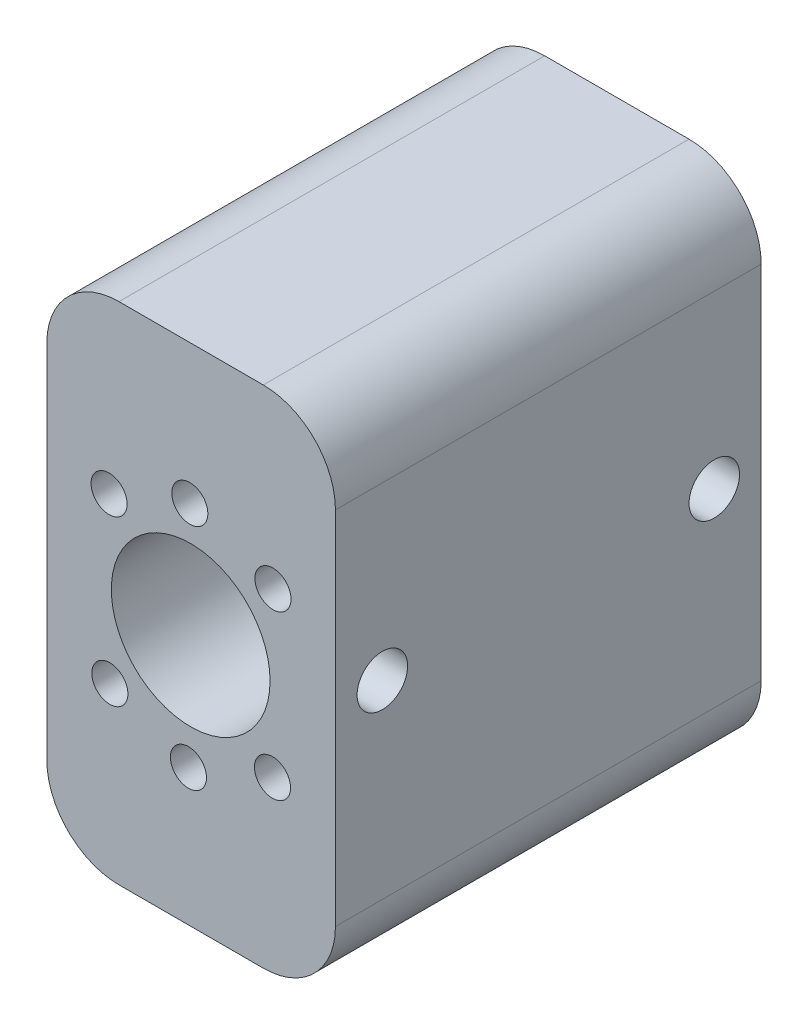
ISO-10303-21;
HEADER;
FILE_DESCRIPTION(('STEP AP214'),'2;1');
FILE_NAME('part.step','',(''),(''),'','','');
FILE_SCHEMA(('AUTOMOTIVE_DESIGN { 1 0 10303 214 1 1 1 1 }'));
ENDSEC;
DATA;
#1=APPLICATION_CONTEXT('core data for automotive mechanical design processes');
#2=APPLICATION_PROTOCOL_DEFINITION('international standard','automotive_design',2000,#1);
#3=PRODUCT_CONTEXT('',#1,'mechanical');
#4=PRODUCT('Part','Part','',(#3));
#5=PRODUCT_RELATED_PRODUCT_CATEGORY('part','',(#4));
#6=PRODUCT_DEFINITION_FORMATION('','',#4);
#7=PRODUCT_DEFINITION_CONTEXT('part definition',#1,'design');
#8=PRODUCT_DEFINITION('design','',#6,#7);
#9=PRODUCT_DEFINITION_SHAPE('','',#8);
#10=(LENGTH_UNIT() NAMED_UNIT(*) SI_UNIT(.MILLI.,.METRE.));
#11=(NAMED_UNIT(*) PLANE_ANGLE_UNIT() SI_UNIT($,.RADIAN.));
#12=(NAMED_UNIT(*) SI_UNIT($,.STERADIAN.) SOLID_ANGLE_UNIT());
#13=UNCERTAINTY_MEASURE_WITH_UNIT(LENGTH_MEASURE(1.E-05),#10,'distance_accuracy_value','');
#14=(GEOMETRIC_REPRESENTATION_CONTEXT(3) GLOBAL_UNCERTAINTY_ASSIGNED_CONTEXT((#13)) GLOBAL_UNIT_ASSIGNED_CONTEXT((#10,
#11,#12)) REPRESENTATION_CONTEXT('',''));
#15=CARTESIAN_POINT('',(0.,0.,0.));
#16=DIRECTION('',(0.,0.,1.));
#17=DIRECTION('',(1.,0.,0.));
#18=AXIS2_PLACEMENT_3D('',#15,#16,#17);
#19=CARTESIAN_POINT('',(-9.93916934376417,25.062794648046,59.));
#20=DIRECTION('',(0.,0.,-1.));
#21=DIRECTION('',(-1.,0.,0.));
#22=AXIS2_PLACEMENT_3D('',#19,#20,#21);
#23=CYLINDRICAL_SURFACE('',#22,10.);
#24=DIRECTION('',(0.,0.,1.));
#25=VECTOR('',#24,1.);
#26=CARTESIAN_POINT('',(-9.93916934376417,35.0627946480461,59.));
#27=LINE('',#26,#25);
#28=CARTESIAN_POINT('',(-9.93916934376417,35.0627946480461,0.));
#29=VERTEX_POINT('',#28);
#30=CARTESIAN_POINT('',(-9.93916934376417,35.0627946480461,59.));
#31=VERTEX_POINT('',#30);
#32=EDGE_CURVE('E158',#29,#31,#27,.T.);
#33=ORIENTED_EDGE('',*,*,#32,.F.);
#34=CARTESIAN_POINT('',(-9.93916934376417,25.062794648046,0.));
#35=DIRECTION('',(0.,0.,1.));
#36=DIRECTION('',(1.,0.,0.));
#37=AXIS2_PLACEMENT_3D('',#34,#35,#36);
#38=CIRCLE('',#37,10.);
#39=CARTESIAN_POINT('',(-19.9391693437642,25.0627946480461,0.));
#40=VERTEX_POINT('',#39);
#41=EDGE_CURVE('E47',#40,#29,#38,.F.);
#42=ORIENTED_EDGE('',*,*,#41,.F.);
#43=DIRECTION('',(0.,0.,1.));
#44=VECTOR('',#43,1.);
#45=CARTESIAN_POINT('',(-19.9391693437642,25.062794648046,59.));
#46=LINE('',#45,#44);
#47=CARTESIAN_POINT('',(-19.9391693437642,25.0627946480461,59.));
#48=VERTEX_POINT('',#47);
#49=EDGE_CURVE('E161',#48,#40,#46,.F.);
#50=ORIENTED_EDGE('',*,*,#49,.F.);
#51=CARTESIAN_POINT('',(-9.93916934376417,25.062794648046,59.));
#52=DIRECTION('',(0.,0.,1.));
#53=DIRECTION('',(1.,0.,0.));
#54=AXIS2_PLACEMENT_3D('',#51,#52,#53);
#55=CIRCLE('',#54,10.);
#56=EDGE_CURVE('E11',#31,#48,#55,.T.);
#57=ORIENTED_EDGE('',*,*,#56,.F.);
#58=EDGE_LOOP('',(#33,#42,#50,#57));
#59=FACE_BOUND('',#58,.T.);
#60=ADVANCED_FACE('F40',(#59),#23,.T.);
#61=CARTESIAN_POINT('',(-9.93916934376417,-24.937205351954,59.));
#62=DIRECTION('',(0.,0.,1.));
#63=DIRECTION('',(1.,0.,0.));
#64=AXIS2_PLACEMENT_3D('',#61,#62,#63);
#65=CYLINDRICAL_SURFACE('',#64,10.);
#66=DIRECTION('',(0.,0.,1.));
#67=VECTOR('',#66,1.);
#68=CARTESIAN_POINT('',(-19.9391693437642,-24.937205351954,59.));
#69=LINE('',#68,#67);
#70=CARTESIAN_POINT('',(-19.9391693437642,-24.937205351954,0.));
#71=VERTEX_POINT('',#70);
#72=CARTESIAN_POINT('',(-19.9391693437642,-24.937205351954,59.));
#73=VERTEX_POINT('',#72);
#74=EDGE_CURVE('E147',#71,#73,#69,.T.);
#75=ORIENTED_EDGE('',*,*,#74,.F.);
#76=CARTESIAN_POINT('',(-9.93916934376417,-24.937205351954,0.));
#77=DIRECTION('',(0.,0.,1.));
#78=DIRECTION('',(1.,0.,0.));
#79=AXIS2_PLACEMENT_3D('',#76,#77,#78);
#80=CIRCLE('',#79,10.);
#81=CARTESIAN_POINT('',(-9.93916934376417,-34.937205351954,0.));
#82=VERTEX_POINT('',#81);
#83=EDGE_CURVE('E153',#82,#71,#80,.F.);
#84=ORIENTED_EDGE('',*,*,#83,.F.);
#85=DIRECTION('',(0.,0.,1.));
#86=VECTOR('',#85,1.);
#87=CARTESIAN_POINT('',(-9.93916934376417,-34.937205351954,59.));
#88=LINE('',#87,#86);
#89=CARTESIAN_POINT('',(-9.93916934376417,-34.937205351954,59.));
#90=VERTEX_POINT('',#89);
#91=EDGE_CURVE('E150',#90,#82,#88,.F.);
#92=ORIENTED_EDGE('',*,*,#91,.F.);
#93=CARTESIAN_POINT('',(-9.93916934376417,-24.937205351954,59.));
#94=DIRECTION('',(0.,0.,1.));
#95=DIRECTION('',(1.,0.,0.));
#96=AXIS2_PLACEMENT_3D('',#93,#94,#95);
#97=CIRCLE('',#96,10.);
#98=EDGE_CURVE('E156',#73,#90,#97,.T.);
#99=ORIENTED_EDGE('',*,*,#98,.F.);
#100=EDGE_LOOP('',(#75,#84,#92,#99));
#101=FACE_BOUND('',#100,.T.);
#102=ADVANCED_FACE('F190',(#101),#65,.T.);
#103=CARTESIAN_POINT('',(10.0608306562358,-24.937205351954,59.));
#104=DIRECTION('',(0.,0.,1.));
#105=DIRECTION('',(1.,0.,0.));
#106=AXIS2_PLACEMENT_3D('',#103,#104,#105);
#107=CYLINDRICAL_SURFACE('',#106,10.);
#108=DIRECTION('',(0.,0.,-1.));
#109=VECTOR('',#108,1.);
#110=CARTESIAN_POINT('',(20.0608306562358,-24.937205351954,59.));
#111=LINE('',#110,#109);
#112=CARTESIAN_POINT('',(20.0608306562358,-24.937205351954,59.));
#113=VERTEX_POINT('',#112);
#114=CARTESIAN_POINT('',(20.0608306562358,-24.937205351954,0.));
#115=VERTEX_POINT('',#114);
#116=EDGE_CURVE('E128',#113,#115,#111,.T.);
#117=ORIENTED_EDGE('',*,*,#116,.F.);
#118=CARTESIAN_POINT('',(10.0608306562358,-24.937205351954,59.));
#119=DIRECTION('',(0.,0.,1.));
#120=DIRECTION('',(1.,0.,0.));
#121=AXIS2_PLACEMENT_3D('',#118,#119,#120);
#122=CIRCLE('',#121,10.);
#123=CARTESIAN_POINT('',(10.0608306562358,-34.937205351954,59.));
#124=VERTEX_POINT('',#123);
#125=EDGE_CURVE('E143',#124,#113,#122,.T.);
#126=ORIENTED_EDGE('',*,*,#125,.F.);
#127=DIRECTION('',(0.,0.,-1.));
#128=VECTOR('',#127,1.);
#129=CARTESIAN_POINT('',(10.0608306562358,-34.937205351954,59.));
#130=LINE('',#129,#128);
#131=CARTESIAN_POINT('',(10.0608306562358,-34.937205351954,0.));
#132=VERTEX_POINT('',#131);
#133=EDGE_CURVE('E140',#132,#124,#130,.F.);
#134=ORIENTED_EDGE('',*,*,#133,.F.);
#135=CARTESIAN_POINT('',(10.0608306562358,-24.937205351954,0.));
#136=DIRECTION('',(0.,0.,1.));
#137=DIRECTION('',(1.,0.,0.));
#138=AXIS2_PLACEMENT_3D('',#135,#136,#137);
#139=CIRCLE('',#138,10.);
#140=EDGE_CURVE('E145',#115,#132,#139,.F.);
#141=ORIENTED_EDGE('',*,*,#140,.F.);
#142=EDGE_LOOP('',(#117,#126,#134,#141));
#143=FACE_BOUND('',#142,.T.);
#144=ADVANCED_FACE('F203',(#143),#107,.T.);
#145=CARTESIAN_POINT('',(10.0608306562358,25.062794648046,59.));
#146=DIRECTION('',(0.,0.,1.));
#147=DIRECTION('',(1.,0.,0.));
#148=AXIS2_PLACEMENT_3D('',#145,#146,#147);
#149=CYLINDRICAL_SURFACE('',#148,10.);
#150=DIRECTION('',(0.,0.,1.));
#151=VECTOR('',#150,1.);
#152=CARTESIAN_POINT('',(20.0608306562358,25.062794648046,59.));
#153=LINE('',#152,#151);
#154=CARTESIAN_POINT('',(20.0608306562358,25.0627946480461,0.));
#155=VERTEX_POINT('',#154);
#156=CARTESIAN_POINT('',(20.0608306562358,25.0627946480461,59.));
#157=VERTEX_POINT('',#156);
#158=EDGE_CURVE('E117',#155,#157,#153,.T.);
#159=ORIENTED_EDGE('',*,*,#158,.F.);
#160=CARTESIAN_POINT('',(10.0608306562358,25.062794648046,0.));
#161=DIRECTION('',(0.,0.,1.));
#162=DIRECTION('',(1.,0.,0.));
#163=AXIS2_PLACEMENT_3D('',#160,#161,#162);
#164=CIRCLE('',#163,10.);
#165=CARTESIAN_POINT('',(10.0608306562358,35.0627946480461,0.));
#166=VERTEX_POINT('',#165);
#167=EDGE_CURVE('E101',#166,#155,#164,.F.);
#168=ORIENTED_EDGE('',*,*,#167,.F.);
#169=DIRECTION('',(0.,0.,1.));
#170=VECTOR('',#169,1.);
#171=CARTESIAN_POINT('',(10.0608306562358,35.0627946480461,59.));
#172=LINE('',#171,#170);
#173=CARTESIAN_POINT('',(10.0608306562358,35.0627946480461,59.));
#174=VERTEX_POINT('',#173);
#175=EDGE_CURVE('E114',#174,#166,#172,.F.);
#176=ORIENTED_EDGE('',*,*,#175,.F.);
#177=CARTESIAN_POINT('',(10.0608306562358,25.062794648046,59.));
#178=DIRECTION('',(0.,0.,1.));
#179=DIRECTION('',(1.,0.,0.));
#180=AXIS2_PLACEMENT_3D('',#177,#178,#179);
#181=CIRCLE('',#180,10.);
#182=EDGE_CURVE('E113',#157,#174,#181,.T.);
#183=ORIENTED_EDGE('',*,*,#182,.F.);
#184=EDGE_LOOP('',(#159,#168,#176,#183));
#185=FACE_BOUND('',#184,.T.);
#186=ADVANCED_FACE('F118',(#185),#149,.T.);
#187=CARTESIAN_POINT('',(-19.9391693437642,35.0627946480461,59.));
#188=DIRECTION('',(1.,0.,0.));
#189=DIRECTION('',(0.,0.,-1.));
#190=AXIS2_PLACEMENT_3D('',#187,#188,#189);
#191=PLANE('',#190);
#192=CARTESIAN_POINT('',(-19.9391693437642,0.0627946480460627,39.5));
#193=DIRECTION('',(-1.,0.,0.));
#194=DIRECTION('',(0.,0.,1.));
#195=AXIS2_PLACEMENT_3D('',#192,#193,#194);
#196=CIRCLE('',#195,2.55);
#197=CARTESIAN_POINT('',(-19.9391693437642,0.0627946480460627,42.05));
#198=VERTEX_POINT('',#197);
#199=EDGE_CURVE('E581',#198,#198,#196,.T.);
#200=ORIENTED_EDGE('',*,*,#199,.F.);
#201=EDGE_LOOP('',(#200));
#202=FACE_BOUND('',#201,.T.);
#203=CARTESIAN_POINT('',(-19.9391693437642,0.0627946480460601,19.5));
#204=DIRECTION('',(-1.,0.,0.));
#205=DIRECTION('',(0.,0.,1.));
#206=AXIS2_PLACEMENT_3D('',#203,#204,#205);
#207=CIRCLE('',#206,2.55);
#208=CARTESIAN_POINT('',(-19.9391693437642,0.0627946480460601,22.05));
#209=VERTEX_POINT('',#208);
#210=EDGE_CURVE('E588',#209,#209,#207,.T.);
#211=ORIENTED_EDGE('',*,*,#210,.F.);
#212=EDGE_LOOP('',(#211));
#213=FACE_BOUND('',#212,.T.);
#214=CARTESIAN_POINT('',(-19.9391693437642,10.0627946480461,29.5));
#215=DIRECTION('',(-1.,0.,0.));
#216=DIRECTION('',(0.,0.,1.));
#217=AXIS2_PLACEMENT_3D('',#214,#215,#216);
#218=CIRCLE('',#217,2.55);
#219=CARTESIAN_POINT('',(-19.9391693437642,10.0627946480461,32.05));
#220=VERTEX_POINT('',#219);
#221=EDGE_CURVE('E572',#220,#220,#218,.T.);
#222=ORIENTED_EDGE('',*,*,#221,.F.);
#223=EDGE_LOOP('',(#222));
#224=FACE_BOUND('',#223,.T.);
#225=CARTESIAN_POINT('',(-19.9391693437642,-9.93720535195394,29.5));
#226=DIRECTION('',(-1.,0.,0.));
#227=DIRECTION('',(0.,0.,1.));
#228=AXIS2_PLACEMENT_3D('',#225,#226,#227);
#229=CIRCLE('',#228,2.55);
#230=CARTESIAN_POINT('',(-19.9391693437642,-9.93720535195394,32.05));
#231=VERTEX_POINT('',#230);
#232=EDGE_CURVE('E561',#231,#231,#229,.T.);
#233=ORIENTED_EDGE('',*,*,#232,.F.);
#234=EDGE_LOOP('',(#233));
#235=FACE_BOUND('',#234,.T.);
#236=CARTESIAN_POINT('',(-19.9391693437642,0.0627946480460592,29.5));
#237=DIRECTION('',(-1.,0.,0.));
#238=DIRECTION('',(0.,0.,1.));
#239=AXIS2_PLACEMENT_3D('',#236,#237,#238);
#240=CIRCLE('',#239,2.55);
#241=CARTESIAN_POINT('',(-19.9391693437642,0.0627946480460592,32.05));
#242=VERTEX_POINT('',#241);
#243=EDGE_CURVE('E584',#242,#242,#240,.T.);
#244=ORIENTED_EDGE('',*,*,#243,.F.);
#245=EDGE_LOOP('',(#244));
#246=FACE_BOUND('',#245,.T.);
#247=DIRECTION('',(0.,-1.,0.));
#248=VECTOR('',#247,1.);
#249=CARTESIAN_POINT('',(-19.9391693437642,35.0627946480461,59.));
#250=LINE('',#249,#248);
#251=EDGE_CURVE('E131',#48,#73,#250,.T.);
#252=ORIENTED_EDGE('',*,*,#251,.F.);
#253=ORIENTED_EDGE('',*,*,#49,.T.);
#254=DIRECTION('',(0.,-1.,0.));
#255=VECTOR('',#254,1.);
#256=CARTESIAN_POINT('',(-19.9391693437642,35.0627946480461,0.));
#257=LINE('',#256,#255);
#258=EDGE_CURVE('E133',#40,#71,#257,.T.);
#259=ORIENTED_EDGE('',*,*,#258,.T.);
#260=ORIENTED_EDGE('',*,*,#74,.T.);
#261=EDGE_LOOP('',(#252,#253,#259,#260));
#262=FACE_BOUND('',#261,.T.);
#263=ADVANCED_FACE('F192',(#202,#213,#224,#235,#246,#262),#191,.F.);
#264=CARTESIAN_POINT('',(-19.9391693437642,-34.937205351954,59.));
#265=DIRECTION('',(0.,1.,0.));
#266=DIRECTION('',(0.,0.,1.));
#267=AXIS2_PLACEMENT_3D('',#264,#265,#266);
#268=PLANE('',#267);
#269=DIRECTION('',(1.,0.,0.));
#270=VECTOR('',#269,1.);
#271=CARTESIAN_POINT('',(-19.9391693437642,-34.937205351954,59.));
#272=LINE('',#271,#270);
#273=EDGE_CURVE('E168',#90,#124,#272,.T.);
#274=ORIENTED_EDGE('',*,*,#273,.F.);
#275=ORIENTED_EDGE('',*,*,#91,.T.);
#276=DIRECTION('',(1.,0.,0.));
#277=VECTOR('',#276,1.);
#278=CARTESIAN_POINT('',(-19.9391693437642,-34.937205351954,0.));
#279=LINE('',#278,#277);
#280=EDGE_CURVE('E129',#82,#132,#279,.T.);
#281=ORIENTED_EDGE('',*,*,#280,.T.);
#282=ORIENTED_EDGE('',*,*,#133,.T.);
#283=EDGE_LOOP('',(#274,#275,#281,#282));
#284=FACE_BOUND('',#283,.T.);
#285=ADVANCED_FACE('F194',(#284),#268,.F.);
#286=CARTESIAN_POINT('',(20.0608306562358,35.0627946480461,59.));
#287=DIRECTION('',(1.,0.,0.));
#288=DIRECTION('',(0.,0.,-1.));
#289=AXIS2_PLACEMENT_3D('',#286,#287,#288);
#290=PLANE('',#289);
#291=CARTESIAN_POINT('',(20.0608306562358,1.34000523,52.5));
#292=DIRECTION('',(1.,0.,0.));
#293=DIRECTION('',(0.,0.,-1.));
#294=AXIS2_PLACEMENT_3D('',#291,#292,#293);
#295=CIRCLE('',#294,3.5);
#296=CARTESIAN_POINT('',(20.0608306562358,1.34000523,49.));
#297=VERTEX_POINT('',#296);
#298=EDGE_CURVE('E558',#297,#297,#295,.T.);
#299=ORIENTED_EDGE('',*,*,#298,.F.);
#300=EDGE_LOOP('',(#299));
#301=FACE_BOUND('',#300,.T.);
#302=CARTESIAN_POINT('',(20.0608306562358,1.34000523,6.5));
#303=DIRECTION('',(1.,0.,0.));
#304=DIRECTION('',(0.,0.,-1.));
#305=AXIS2_PLACEMENT_3D('',#302,#303,#304);
#306=CIRCLE('',#305,3.5);
#307=CARTESIAN_POINT('',(20.0608306562358,1.34000523,3.));
#308=VERTEX_POINT('',#307);
#309=EDGE_CURVE('E564',#308,#308,#306,.T.);
#310=ORIENTED_EDGE('',*,*,#309,.F.);
#311=EDGE_LOOP('',(#310));
#312=FACE_BOUND('',#311,.T.);
#313=DIRECTION('',(0.,-1.,0.));
#314=VECTOR('',#313,1.);
#315=CARTESIAN_POINT('',(20.0608306562358,35.0627946480461,59.));
#316=LINE('',#315,#314);
#317=EDGE_CURVE('E164',#157,#113,#316,.T.);
#318=ORIENTED_EDGE('',*,*,#317,.T.);
#319=ORIENTED_EDGE('',*,*,#116,.T.);
#320=DIRECTION('',(0.,-1.,0.));
#321=VECTOR('',#320,1.);
#322=CARTESIAN_POINT('',(20.0608306562358,35.0627946480461,0.));
#323=LINE('',#322,#321);
#324=EDGE_CURVE('E107',#155,#115,#323,.T.);
#325=ORIENTED_EDGE('',*,*,#324,.F.);
#326=ORIENTED_EDGE('',*,*,#158,.T.);
#327=EDGE_LOOP('',(#318,#319,#325,#326));
#328=FACE_BOUND('',#327,.T.);
#329=ADVANCED_FACE('F126',(#301,#312,#328),#290,.T.);
#330=CARTESIAN_POINT('',(-19.9391693437642,35.0627946480461,59.));
#331=DIRECTION('',(0.,1.,0.));
#332=DIRECTION('',(0.,0.,1.));
#333=AXIS2_PLACEMENT_3D('',#330,#331,#332);
#334=PLANE('',#333);
#335=DIRECTION('',(1.,0.,0.));
#336=VECTOR('',#335,1.);
#337=CARTESIAN_POINT('',(-19.9391693437642,35.0627946480461,0.));
#338=LINE('',#337,#336);
#339=EDGE_CURVE('E109',#29,#166,#338,.T.);
#340=ORIENTED_EDGE('',*,*,#339,.F.);
#341=ORIENTED_EDGE('',*,*,#32,.T.);
#342=DIRECTION('',(1.,0.,0.));
#343=VECTOR('',#342,1.);
#344=CARTESIAN_POINT('',(-19.9391693437642,35.0627946480461,59.));
#345=LINE('',#344,#343);
#346=EDGE_CURVE('E123',#31,#174,#345,.T.);
#347=ORIENTED_EDGE('',*,*,#346,.T.);
#348=ORIENTED_EDGE('',*,*,#175,.T.);
#349=EDGE_LOOP('',(#340,#341,#347,#348));
#350=FACE_BOUND('',#349,.T.);
#351=ADVANCED_FACE('F163',(#350),#334,.T.);
#352=CARTESIAN_POINT('',(0.,0.,59.));
#353=DIRECTION('',(0.,0.,1.));
#354=DIRECTION('',(1.,0.,0.));
#355=AXIS2_PLACEMENT_3D('',#352,#353,#354);
#356=PLANE('',#355);
#357=CARTESIAN_POINT('',(-11.3137084989847,11.3137084989848,59.));
#358=DIRECTION('',(0.,0.,1.));
#359=DIRECTION('',(1.,0.,0.));
#360=AXIS2_PLACEMENT_3D('',#357,#358,#359);
#361=CIRCLE('',#360,2.5);
#362=CARTESIAN_POINT('',(-8.8137084989847,11.3137084989848,59.));
#363=VERTEX_POINT('',#362);
#364=EDGE_CURVE('E612',#363,#363,#361,.T.);
#365=ORIENTED_EDGE('',*,*,#364,.F.);
#366=EDGE_LOOP('',(#365));
#367=FACE_BOUND('',#366,.T.);
#368=CARTESIAN_POINT('',(-0.122338903727766,15.7597255865445,59.));
#369=DIRECTION('',(0.,0.,1.));
#370=DIRECTION('',(1.,0.,0.));
#371=AXIS2_PLACEMENT_3D('',#368,#369,#370);
#372=CIRCLE('',#371,2.5);
#373=CARTESIAN_POINT('',(2.37766109627223,15.7597255865445,59.));
#374=VERTEX_POINT('',#373);
#375=EDGE_CURVE('E618',#374,#374,#372,.T.);
#376=ORIENTED_EDGE('',*,*,#375,.F.);
#377=EDGE_LOOP('',(#376));
#378=FACE_BOUND('',#377,.T.);
#379=CARTESIAN_POINT('',(11.4026934424135,11.2636964844784,59.));
#380=DIRECTION('',(0.,0.,1.));
#381=DIRECTION('',(1.,0.,0.));
#382=AXIS2_PLACEMENT_3D('',#379,#380,#381);
#383=CIRCLE('',#382,2.5);
#384=CARTESIAN_POINT('',(13.9026934424135,11.2636964844784,59.));
#385=VERTEX_POINT('',#384);
#386=EDGE_CURVE('E624',#385,#385,#383,.T.);
#387=ORIENTED_EDGE('',*,*,#386,.F.);
#388=EDGE_LOOP('',(#387));
#389=FACE_BOUND('',#388,.T.);
#390=CARTESIAN_POINT('',(11.3393690888633,-11.4064220865028,59.));
#391=DIRECTION('',(0.,0.,1.));
#392=DIRECTION('',(1.,0.,0.));
#393=AXIS2_PLACEMENT_3D('',#390,#391,#392);
#394=CIRCLE('',#393,2.5);
#395=CARTESIAN_POINT('',(13.8393690888633,-11.4064220865028,59.));
#396=VERTEX_POINT('',#395);
#397=EDGE_CURVE('E183',#396,#396,#394,.T.);
#398=ORIENTED_EDGE('',*,*,#397,.F.);
#399=EDGE_LOOP('',(#398));
#400=FACE_BOUND('',#399,.T.);
#401=CARTESIAN_POINT('',(-0.312311964378448,-16.0290998956694,59.));
#402=DIRECTION('',(0.,0.,1.));
#403=DIRECTION('',(1.,0.,0.));
#404=AXIS2_PLACEMENT_3D('',#401,#402,#403);
#405=CIRCLE('',#404,2.5);
#406=CARTESIAN_POINT('',(2.18768803562155,-16.0290998956694,59.));
#407=VERTEX_POINT('',#406);
#408=EDGE_CURVE('E602',#407,#407,#405,.T.);
#409=ORIENTED_EDGE('',*,*,#408,.F.);
#410=EDGE_LOOP('',(#409));
#411=FACE_BOUND('',#410,.T.);
#412=CARTESIAN_POINT('',(-11.2041007750175,-11.4064220865028,59.));
#413=DIRECTION('',(0.,0.,1.));
#414=DIRECTION('',(1.,0.,0.));
#415=AXIS2_PLACEMENT_3D('',#412,#413,#414);
#416=CIRCLE('',#415,2.5);
#417=CARTESIAN_POINT('',(-8.70410077501747,-11.4064220865028,59.));
#418=VERTEX_POINT('',#417);
#419=EDGE_CURVE('E596',#418,#418,#416,.T.);
#420=ORIENTED_EDGE('',*,*,#419,.F.);
#421=EDGE_LOOP('',(#420));
#422=FACE_BOUND('',#421,.T.);
#423=CARTESIAN_POINT('',(0.,0.,59.));
#424=DIRECTION('',(0.,0.,1.));
#425=DIRECTION('',(1.,0.,0.));
#426=AXIS2_PLACEMENT_3D('',#423,#424,#425);
#427=CIRCLE('',#426,11.);
#428=CARTESIAN_POINT('',(11.,0.,59.));
#429=VERTEX_POINT('',#428);
#430=EDGE_CURVE('E172',#429,#429,#427,.T.);
#431=ORIENTED_EDGE('',*,*,#430,.F.);
#432=EDGE_LOOP('',(#431));
#433=FACE_BOUND('',#432,.T.);
#434=ORIENTED_EDGE('',*,*,#346,.F.);
#435=ORIENTED_EDGE('',*,*,#56,.T.);
#436=ORIENTED_EDGE('',*,*,#251,.T.);
#437=ORIENTED_EDGE('',*,*,#98,.T.);
#438=ORIENTED_EDGE('',*,*,#273,.T.);
#439=ORIENTED_EDGE('',*,*,#125,.T.);
#440=ORIENTED_EDGE('',*,*,#317,.F.);
#441=ORIENTED_EDGE('',*,*,#182,.T.);
#442=EDGE_LOOP('',(#434,#435,#436,#437,#438,#439,#440,#441));
#443=FACE_BOUND('',#442,.T.);
#444=ADVANCED_FACE('F166',(#367,#378,#389,#400,#411,#422,#433,#443),#356,.T.);
#445=CARTESIAN_POINT('',(0.,0.,0.));
#446=DIRECTION('',(0.,0.,1.));
#447=DIRECTION('',(1.,0.,0.));
#448=AXIS2_PLACEMENT_3D('',#445,#446,#447);
#449=PLANE('',#448);
#450=CARTESIAN_POINT('',(-11.3137084989847,11.3137084989848,0.));
#451=DIRECTION('',(0.,0.,1.));
#452=DIRECTION('',(1.,0.,0.));
#453=AXIS2_PLACEMENT_3D('',#450,#451,#452);
#454=CIRCLE('',#453,2.5);
#455=CARTESIAN_POINT('',(-8.8137084989847,11.3137084989848,0.));
#456=VERTEX_POINT('',#455);
#457=EDGE_CURVE('E180',#456,#456,#454,.T.);
#458=ORIENTED_EDGE('',*,*,#457,.T.);
#459=EDGE_LOOP('',(#458));
#460=FACE_BOUND('',#459,.T.);
#461=CARTESIAN_POINT('',(-0.122338903727766,15.7597255865445,0.));
#462=DIRECTION('',(0.,0.,1.));
#463=DIRECTION('',(1.,0.,0.));
#464=AXIS2_PLACEMENT_3D('',#461,#462,#463);
#465=CIRCLE('',#464,2.5);
#466=CARTESIAN_POINT('',(2.37766109627223,15.7597255865445,0.));
#467=VERTEX_POINT('',#466);
#468=EDGE_CURVE('E615',#467,#467,#465,.T.);
#469=ORIENTED_EDGE('',*,*,#468,.T.);
#470=EDGE_LOOP('',(#469));
#471=FACE_BOUND('',#470,.T.);
#472=CARTESIAN_POINT('',(11.4026934424135,11.2636964844784,0.));
#473=DIRECTION('',(0.,0.,1.));
#474=DIRECTION('',(1.,0.,0.));
#475=AXIS2_PLACEMENT_3D('',#472,#473,#474);
#476=CIRCLE('',#475,2.5);
#477=CARTESIAN_POINT('',(13.9026934424135,11.2636964844784,0.));
#478=VERTEX_POINT('',#477);
#479=EDGE_CURVE('E621',#478,#478,#476,.T.);
#480=ORIENTED_EDGE('',*,*,#479,.T.);
#481=EDGE_LOOP('',(#480));
#482=FACE_BOUND('',#481,.T.);
#483=CARTESIAN_POINT('',(11.3393690888633,-11.4064220865028,0.));
#484=DIRECTION('',(0.,0.,1.));
#485=DIRECTION('',(1.,0.,0.));
#486=AXIS2_PLACEMENT_3D('',#483,#484,#485);
#487=CIRCLE('',#486,2.5);
#488=CARTESIAN_POINT('',(13.8393690888633,-11.4064220865028,0.));
#489=VERTEX_POINT('',#488);
#490=EDGE_CURVE('E626',#489,#489,#487,.T.);
#491=ORIENTED_EDGE('',*,*,#490,.T.);
#492=EDGE_LOOP('',(#491));
#493=FACE_BOUND('',#492,.T.);
#494=CARTESIAN_POINT('',(-0.312311964378448,-16.0290998956694,0.));
#495=DIRECTION('',(0.,0.,1.));
#496=DIRECTION('',(1.,0.,0.));
#497=AXIS2_PLACEMENT_3D('',#494,#495,#496);
#498=CIRCLE('',#497,2.5);
#499=CARTESIAN_POINT('',(2.18768803562155,-16.0290998956694,0.));
#500=VERTEX_POINT('',#499);
#501=EDGE_CURVE('E599',#500,#500,#498,.T.);
#502=ORIENTED_EDGE('',*,*,#501,.T.);
#503=EDGE_LOOP('',(#502));
#504=FACE_BOUND('',#503,.T.);
#505=CARTESIAN_POINT('',(-11.2041007750175,-11.4064220865028,0.));
#506=DIRECTION('',(0.,0.,1.));
#507=DIRECTION('',(1.,0.,0.));
#508=AXIS2_PLACEMENT_3D('',#505,#506,#507);
#509=CIRCLE('',#508,2.5);
#510=CARTESIAN_POINT('',(-8.70410077501747,-11.4064220865028,0.));
#511=VERTEX_POINT('',#510);
#512=EDGE_CURVE('E605',#511,#511,#509,.T.);
#513=ORIENTED_EDGE('',*,*,#512,.T.);
#514=EDGE_LOOP('',(#513));
#515=FACE_BOUND('',#514,.T.);
#516=CARTESIAN_POINT('',(0.,0.,0.));
#517=DIRECTION('',(0.,0.,1.));
#518=DIRECTION('',(1.,0.,0.));
#519=AXIS2_PLACEMENT_3D('',#516,#517,#518);
#520=CIRCLE('',#519,11.);
#521=CARTESIAN_POINT('',(11.,0.,0.));
#522=VERTEX_POINT('',#521);
#523=EDGE_CURVE('E175',#522,#522,#520,.T.);
#524=ORIENTED_EDGE('',*,*,#523,.T.);
#525=EDGE_LOOP('',(#524));
#526=FACE_BOUND('',#525,.T.);
#527=ORIENTED_EDGE('',*,*,#258,.F.);
#528=ORIENTED_EDGE('',*,*,#41,.T.);
#529=ORIENTED_EDGE('',*,*,#339,.T.);
#530=ORIENTED_EDGE('',*,*,#167,.T.);
#531=ORIENTED_EDGE('',*,*,#324,.T.);
#532=ORIENTED_EDGE('',*,*,#140,.T.);
#533=ORIENTED_EDGE('',*,*,#280,.F.);
#534=ORIENTED_EDGE('',*,*,#83,.T.);
#535=EDGE_LOOP('',(#527,#528,#529,#530,#531,#532,#533,#534));
#536=FACE_BOUND('',#535,.T.);
#537=ADVANCED_FACE('F104',(#460,#471,#482,#493,#504,#515,#526,#536),#449,.F.);
#538=CARTESIAN_POINT('',(0.,0.,59.));
#539=DIRECTION('',(0.,0.,-1.));
#540=DIRECTION('',(-1.,0.,0.));
#541=AXIS2_PLACEMENT_3D('',#538,#539,#540);
#542=CYLINDRICAL_SURFACE('',#541,11.);
#543=ORIENTED_EDGE('',*,*,#430,.T.);
#544=EDGE_LOOP('',(#543));
#545=FACE_BOUND('',#544,.T.);
#546=ORIENTED_EDGE('',*,*,#523,.F.);
#547=EDGE_LOOP('',(#546));
#548=FACE_BOUND('',#547,.T.);
#549=ADVANCED_FACE('F402',(#545,#548),#542,.F.);
#550=CARTESIAN_POINT('',(-11.2041007750175,-11.4064220865028,59.));
#551=DIRECTION('',(0.,0.,-1.));
#552=DIRECTION('',(-1.,0.,0.));
#553=AXIS2_PLACEMENT_3D('',#550,#551,#552);
#554=CYLINDRICAL_SURFACE('',#553,2.5);
#555=ORIENTED_EDGE('',*,*,#419,.T.);
#556=EDGE_LOOP('',(#555));
#557=FACE_BOUND('',#556,.T.);
#558=ORIENTED_EDGE('',*,*,#512,.F.);
#559=EDGE_LOOP('',(#558));
#560=FACE_BOUND('',#559,.T.);
#561=ADVANCED_FACE('F391',(#557,#560),#554,.F.);
#562=CARTESIAN_POINT('',(-0.312311964378448,-16.0290998956694,59.));
#563=DIRECTION('',(0.,0.,-1.));
#564=DIRECTION('',(-1.,0.,0.));
#565=AXIS2_PLACEMENT_3D('',#562,#563,#564);
#566=CYLINDRICAL_SURFACE('',#565,2.5);
#567=ORIENTED_EDGE('',*,*,#408,.T.);
#568=EDGE_LOOP('',(#567));
#569=FACE_BOUND('',#568,.T.);
#570=ORIENTED_EDGE('',*,*,#501,.F.);
#571=EDGE_LOOP('',(#570));
#572=FACE_BOUND('',#571,.T.);
#573=ADVANCED_FACE('F380',(#569,#572),#566,.F.);
#574=CARTESIAN_POINT('',(11.3393690888633,-11.4064220865028,59.));
#575=DIRECTION('',(0.,0.,-1.));
#576=DIRECTION('',(-1.,0.,0.));
#577=AXIS2_PLACEMENT_3D('',#574,#575,#576);
#578=CYLINDRICAL_SURFACE('',#577,2.5);
#579=ORIENTED_EDGE('',*,*,#397,.T.);
#580=EDGE_LOOP('',(#579));
#581=FACE_BOUND('',#580,.T.);
#582=ORIENTED_EDGE('',*,*,#490,.F.);
#583=EDGE_LOOP('',(#582));
#584=FACE_BOUND('',#583,.T.);
#585=ADVANCED_FACE('F369',(#581,#584),#578,.F.);
#586=CARTESIAN_POINT('',(11.4026934424135,11.2636964844784,59.));
#587=DIRECTION('',(0.,0.,-1.));
#588=DIRECTION('',(-1.,0.,0.));
#589=AXIS2_PLACEMENT_3D('',#586,#587,#588);
#590=CYLINDRICAL_SURFACE('',#589,2.5);
#591=ORIENTED_EDGE('',*,*,#386,.T.);
#592=EDGE_LOOP('',(#591));
#593=FACE_BOUND('',#592,.T.);
#594=ORIENTED_EDGE('',*,*,#479,.F.);
#595=EDGE_LOOP('',(#594));
#596=FACE_BOUND('',#595,.T.);
#597=ADVANCED_FACE('F358',(#593,#596),#590,.F.);
#598=CARTESIAN_POINT('',(-0.122338903727766,15.7597255865445,59.));
#599=DIRECTION('',(0.,0.,-1.));
#600=DIRECTION('',(-1.,0.,0.));
#601=AXIS2_PLACEMENT_3D('',#598,#599,#600);
#602=CYLINDRICAL_SURFACE('',#601,2.5);
#603=ORIENTED_EDGE('',*,*,#375,.T.);
#604=EDGE_LOOP('',(#603));
#605=FACE_BOUND('',#604,.T.);
#606=ORIENTED_EDGE('',*,*,#468,.F.);
#607=EDGE_LOOP('',(#606));
#608=FACE_BOUND('',#607,.T.);
#609=ADVANCED_FACE('F347',(#605,#608),#602,.F.);
#610=CARTESIAN_POINT('',(-11.3137084989847,11.3137084989848,59.));
#611=DIRECTION('',(0.,0.,-1.));
#612=DIRECTION('',(-1.,0.,0.));
#613=AXIS2_PLACEMENT_3D('',#610,#611,#612);
#614=CYLINDRICAL_SURFACE('',#613,2.5);
#615=ORIENTED_EDGE('',*,*,#364,.T.);
#616=EDGE_LOOP('',(#615));
#617=FACE_BOUND('',#616,.T.);
#618=ORIENTED_EDGE('',*,*,#457,.F.);
#619=EDGE_LOOP('',(#618));
#620=FACE_BOUND('',#619,.T.);
#621=ADVANCED_FACE('F336',(#617,#620),#614,.F.);
#622=CARTESIAN_POINT('',(-14.9391693437642,0.0627946480460592,29.5));
#623=DIRECTION('',(-1.,0.,0.));
#624=DIRECTION('',(0.,0.,1.));
#625=AXIS2_PLACEMENT_3D('',#622,#623,#624);
#626=CYLINDRICAL_SURFACE('',#625,2.55);
#627=CARTESIAN_POINT('',(-14.9391693437642,0.0627946480460592,29.5));
#628=DIRECTION('',(-1.,0.,0.));
#629=DIRECTION('',(0.,0.,1.));
#630=AXIS2_PLACEMENT_3D('',#627,#628,#629);
#631=CIRCLE('',#630,2.55);
#632=CARTESIAN_POINT('',(-14.9391693437642,0.0627946480460592,32.05));
#633=VERTEX_POINT('',#632);
#634=EDGE_CURVE('E593',#633,#633,#631,.T.);
#635=ORIENTED_EDGE('',*,*,#634,.F.);
#636=EDGE_LOOP('',(#635));
#637=FACE_BOUND('',#636,.T.);
#638=ORIENTED_EDGE('',*,*,#243,.T.);
#639=EDGE_LOOP('',(#638));
#640=FACE_BOUND('',#639,.T.);
#641=ADVANCED_FACE('F325',(#637,#640),#626,.F.);
#642=CARTESIAN_POINT('',(-14.9391693437642,0.0627946480460592,29.5));
#643=DIRECTION('',(-1.,0.,0.));
#644=DIRECTION('',(0.,0.,1.));
#645=AXIS2_PLACEMENT_3D('',#642,#643,#644);
#646=PLANE('',#645);
#647=ORIENTED_EDGE('',*,*,#634,.T.);
#648=EDGE_LOOP('',(#647));
#649=FACE_BOUND('',#648,.T.);
#650=ADVANCED_FACE('F314',(#649),#646,.T.);
#651=CARTESIAN_POINT('',(-14.9391693437642,-9.93720535195394,29.5));
#652=DIRECTION('',(-1.,0.,0.));
#653=DIRECTION('',(0.,0.,1.));
#654=AXIS2_PLACEMENT_3D('',#651,#652,#653);
#655=CYLINDRICAL_SURFACE('',#654,2.55);
#656=CARTESIAN_POINT('',(-14.9391693437642,-9.93720535195394,29.5));
#657=DIRECTION('',(-1.,0.,0.));
#658=DIRECTION('',(0.,0.,1.));
#659=AXIS2_PLACEMENT_3D('',#656,#657,#658);
#660=CIRCLE('',#659,2.55);
#661=CARTESIAN_POINT('',(-14.9391693437642,-9.93720535195394,32.05));
#662=VERTEX_POINT('',#661);
#663=EDGE_CURVE('E557',#662,#662,#660,.T.);
#664=ORIENTED_EDGE('',*,*,#663,.F.);
#665=EDGE_LOOP('',(#664));
#666=FACE_BOUND('',#665,.T.);
#667=ORIENTED_EDGE('',*,*,#232,.T.);
#668=EDGE_LOOP('',(#667));
#669=FACE_BOUND('',#668,.T.);
#670=ADVANCED_FACE('F303',(#666,#669),#655,.F.);
#671=CARTESIAN_POINT('',(-14.9391693437642,-9.93720535195394,29.5));
#672=DIRECTION('',(-1.,0.,0.));
#673=DIRECTION('',(0.,0.,1.));
#674=AXIS2_PLACEMENT_3D('',#671,#672,#673);
#675=PLANE('',#674);
#676=ORIENTED_EDGE('',*,*,#663,.T.);
#677=EDGE_LOOP('',(#676));
#678=FACE_BOUND('',#677,.T.);
#679=ADVANCED_FACE('F292',(#678),#675,.T.);
#680=CARTESIAN_POINT('',(-14.9391693437642,10.0627946480461,29.5));
#681=DIRECTION('',(-1.,0.,0.));
#682=DIRECTION('',(0.,0.,1.));
#683=AXIS2_PLACEMENT_3D('',#680,#681,#682);
#684=CYLINDRICAL_SURFACE('',#683,2.55);
#685=CARTESIAN_POINT('',(-14.9391693437642,10.0627946480461,29.5));
#686=DIRECTION('',(-1.,0.,0.));
#687=DIRECTION('',(0.,0.,1.));
#688=AXIS2_PLACEMENT_3D('',#685,#686,#687);
#689=CIRCLE('',#688,2.55);
#690=CARTESIAN_POINT('',(-14.9391693437642,10.0627946480461,32.05));
#691=VERTEX_POINT('',#690);
#692=EDGE_CURVE('E576',#691,#691,#689,.T.);
#693=ORIENTED_EDGE('',*,*,#692,.F.);
#694=EDGE_LOOP('',(#693));
#695=FACE_BOUND('',#694,.T.);
#696=ORIENTED_EDGE('',*,*,#221,.T.);
#697=EDGE_LOOP('',(#696));
#698=FACE_BOUND('',#697,.T.);
#699=ADVANCED_FACE('F281',(#695,#698),#684,.F.);
#700=CARTESIAN_POINT('',(-14.9391693437642,10.0627946480461,29.5));
#701=DIRECTION('',(-1.,0.,0.));
#702=DIRECTION('',(0.,0.,1.));
#703=AXIS2_PLACEMENT_3D('',#700,#701,#702);
#704=PLANE('',#703);
#705=ORIENTED_EDGE('',*,*,#692,.T.);
#706=EDGE_LOOP('',(#705));
#707=FACE_BOUND('',#706,.T.);
#708=ADVANCED_FACE('F270',(#707),#704,.T.);
#709=CARTESIAN_POINT('',(-14.9391693437642,0.0627946480460601,19.5));
#710=DIRECTION('',(-1.,0.,0.));
#711=DIRECTION('',(0.,0.,1.));
#712=AXIS2_PLACEMENT_3D('',#709,#710,#711);
#713=CYLINDRICAL_SURFACE('',#712,2.55);
#714=CARTESIAN_POINT('',(-14.9391693437642,0.0627946480460601,19.5));
#715=DIRECTION('',(-1.,0.,0.));
#716=DIRECTION('',(0.,0.,1.));
#717=AXIS2_PLACEMENT_3D('',#714,#715,#716);
#718=CIRCLE('',#717,2.55);
#719=CARTESIAN_POINT('',(-14.9391693437642,0.0627946480460601,22.05));
#720=VERTEX_POINT('',#719);
#721=EDGE_CURVE('E575',#720,#720,#718,.T.);
#722=ORIENTED_EDGE('',*,*,#721,.F.);
#723=EDGE_LOOP('',(#722));
#724=FACE_BOUND('',#723,.T.);
#725=ORIENTED_EDGE('',*,*,#210,.T.);
#726=EDGE_LOOP('',(#725));
#727=FACE_BOUND('',#726,.T.);
#728=ADVANCED_FACE('F259',(#724,#727),#713,.F.);
#729=CARTESIAN_POINT('',(-14.9391693437642,0.0627946480460601,19.5));
#730=DIRECTION('',(-1.,0.,0.));
#731=DIRECTION('',(0.,0.,1.));
#732=AXIS2_PLACEMENT_3D('',#729,#730,#731);
#733=PLANE('',#732);
#734=ORIENTED_EDGE('',*,*,#721,.T.);
#735=EDGE_LOOP('',(#734));
#736=FACE_BOUND('',#735,.T.);
#737=ADVANCED_FACE('F248',(#736),#733,.T.);
#738=CARTESIAN_POINT('',(-14.9391693437642,0.0627946480460627,39.5));
#739=DIRECTION('',(-1.,0.,0.));
#740=DIRECTION('',(0.,0.,1.));
#741=AXIS2_PLACEMENT_3D('',#738,#739,#740);
#742=CYLINDRICAL_SURFACE('',#741,2.55);
#743=CARTESIAN_POINT('',(-14.9391693437642,0.0627946480460627,39.5));
#744=DIRECTION('',(-1.,0.,0.));
#745=DIRECTION('',(0.,0.,1.));
#746=AXIS2_PLACEMENT_3D('',#743,#744,#745);
#747=CIRCLE('',#746,2.55);
#748=CARTESIAN_POINT('',(-14.9391693437642,0.0627946480460627,42.05));
#749=VERTEX_POINT('',#748);
#750=EDGE_CURVE('E585',#749,#749,#747,.T.);
#751=ORIENTED_EDGE('',*,*,#750,.F.);
#752=EDGE_LOOP('',(#751));
#753=FACE_BOUND('',#752,.T.);
#754=ORIENTED_EDGE('',*,*,#199,.T.);
#755=EDGE_LOOP('',(#754));
#756=FACE_BOUND('',#755,.T.);
#757=ADVANCED_FACE('F236',(#753,#756),#742,.F.);
#758=CARTESIAN_POINT('',(-14.9391693437642,0.0627946480460627,39.5));
#759=DIRECTION('',(-1.,0.,0.));
#760=DIRECTION('',(0.,0.,1.));
#761=AXIS2_PLACEMENT_3D('',#758,#759,#760);
#762=PLANE('',#761);
#763=ORIENTED_EDGE('',*,*,#750,.T.);
#764=EDGE_LOOP('',(#763));
#765=FACE_BOUND('',#764,.T.);
#766=ADVANCED_FACE('F231',(#765),#762,.T.);
#767=CARTESIAN_POINT('',(15.0608306562358,1.34000523,6.5));
#768=DIRECTION('',(1.,0.,0.));
#769=DIRECTION('',(0.,0.,-1.));
#770=AXIS2_PLACEMENT_3D('',#767,#768,#769);
#771=CYLINDRICAL_SURFACE('',#770,3.5);
#772=CARTESIAN_POINT('',(15.0608306562358,1.34000523,6.5));
#773=DIRECTION('',(1.,0.,0.));
#774=DIRECTION('',(0.,0.,-1.));
#775=AXIS2_PLACEMENT_3D('',#772,#773,#774);
#776=CIRCLE('',#775,3.5);
#777=CARTESIAN_POINT('',(15.0608306562358,1.34000523,3.));
#778=VERTEX_POINT('',#777);
#779=EDGE_CURVE('E569',#778,#778,#776,.T.);
#780=ORIENTED_EDGE('',*,*,#779,.F.);
#781=EDGE_LOOP('',(#780));
#782=FACE_BOUND('',#781,.T.);
#783=ORIENTED_EDGE('',*,*,#309,.T.);
#784=EDGE_LOOP('',(#783));
#785=FACE_BOUND('',#784,.T.);
#786=ADVANCED_FACE('F235',(#782,#785),#771,.F.);
#787=CARTESIAN_POINT('',(15.0608306562358,1.34000523,6.5));
#788=DIRECTION('',(1.,0.,0.));
#789=DIRECTION('',(0.,0.,-1.));
#790=AXIS2_PLACEMENT_3D('',#787,#788,#789);
#791=PLANE('',#790);
#792=ORIENTED_EDGE('',*,*,#779,.T.);
#793=EDGE_LOOP('',(#792));
#794=FACE_BOUND('',#793,.T.);
#795=ADVANCED_FACE('F513',(#794),#791,.T.);
#796=CARTESIAN_POINT('',(15.0608306562358,1.34000523,52.5));
#797=DIRECTION('',(1.,0.,0.));
#798=DIRECTION('',(0.,0.,-1.));
#799=AXIS2_PLACEMENT_3D('',#796,#797,#798);
#800=CYLINDRICAL_SURFACE('',#799,3.5);
#801=CARTESIAN_POINT('',(15.0608306562358,1.34000523,52.5));
#802=DIRECTION('',(1.,0.,0.));
#803=DIRECTION('',(0.,0.,-1.));
#804=AXIS2_PLACEMENT_3D('',#801,#802,#803);
#805=CIRCLE('',#804,3.5);
#806=CARTESIAN_POINT('',(15.0608306562358,1.34000523,49.));
#807=VERTEX_POINT('',#806);
#808=EDGE_CURVE('E556',#807,#807,#805,.T.);
#809=ORIENTED_EDGE('',*,*,#808,.F.);
#810=EDGE_LOOP('',(#809));
#811=FACE_BOUND('',#810,.T.);
#812=ORIENTED_EDGE('',*,*,#298,.T.);
#813=EDGE_LOOP('',(#812));
#814=FACE_BOUND('',#813,.T.);
#815=ADVANCED_FACE('F522',(#811,#814),#800,.F.);
#816=CARTESIAN_POINT('',(15.0608306562358,1.34000523,52.5));
#817=DIRECTION('',(1.,0.,0.));
#818=DIRECTION('',(0.,0.,-1.));
#819=AXIS2_PLACEMENT_3D('',#816,#817,#818);
#820=PLANE('',#819);
#821=ORIENTED_EDGE('',*,*,#808,.T.);
#822=EDGE_LOOP('',(#821));
#823=FACE_BOUND('',#822,.T.);
#824=ADVANCED_FACE('F532',(#823),#820,.T.);
#825=CLOSED_SHELL('',(#60,#102,#144,#186,#263,#285,#329,#351,#444,#537,#549,#561,#573,#585,#597,
#609,#621,#641,#650,#670,#679,#699,#708,#728,#737,#757,#766,#786,#795,#815,#824));
#826=MANIFOLD_SOLID_BREP('B2',#825);
#827=ADVANCED_BREP_SHAPE_REPRESENTATION('',(#18,#826),#14);
#828=SHAPE_DEFINITION_REPRESENTATION(#9,#827);
ENDSEC;
END-ISO-10303-21;
